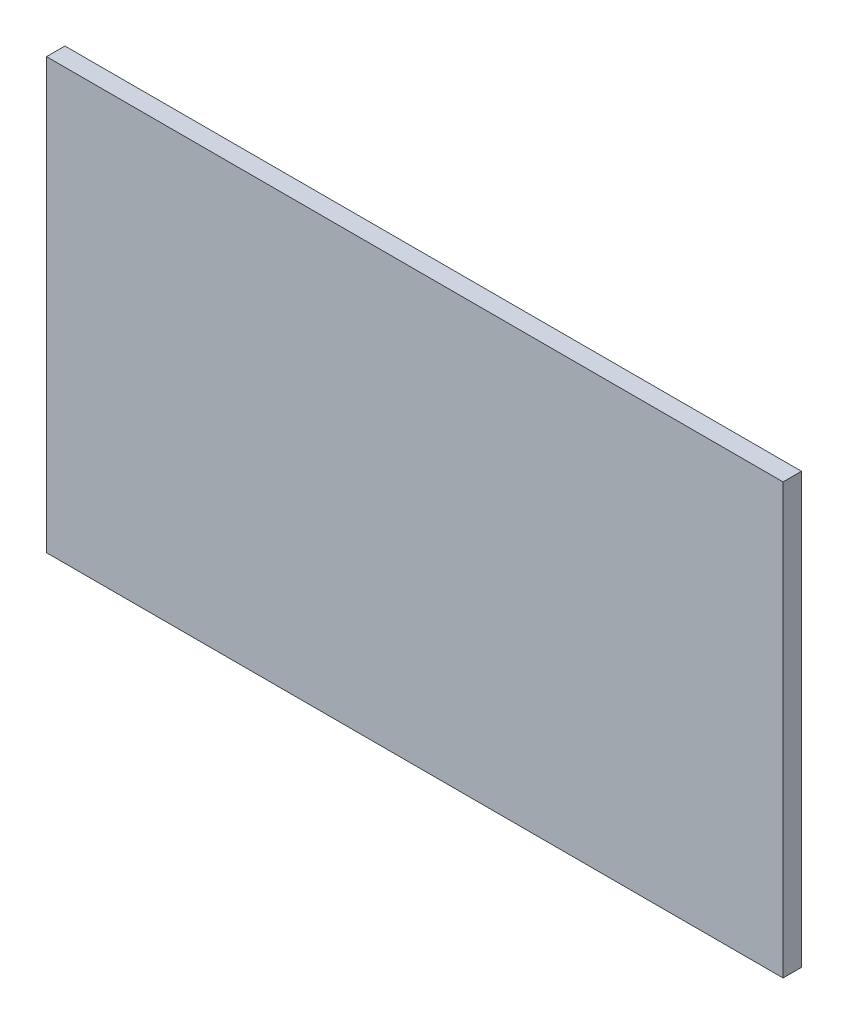
ISO-10303-21;
HEADER;
FILE_DESCRIPTION(('STEP AP214'),'2;1');
FILE_NAME('part.step','',(''),(''),'','','');
FILE_SCHEMA(('AUTOMOTIVE_DESIGN { 1 0 10303 214 1 1 1 1 }'));
ENDSEC;
DATA;
#1=APPLICATION_CONTEXT('core data for automotive mechanical design processes');
#2=APPLICATION_PROTOCOL_DEFINITION('international standard','automotive_design',2000,#1);
#3=PRODUCT_CONTEXT('',#1,'mechanical');
#4=PRODUCT('Part','Part','',(#3));
#5=PRODUCT_RELATED_PRODUCT_CATEGORY('part','',(#4));
#6=PRODUCT_DEFINITION_FORMATION('','',#4);
#7=PRODUCT_DEFINITION_CONTEXT('part definition',#1,'design');
#8=PRODUCT_DEFINITION('design','',#6,#7);
#9=PRODUCT_DEFINITION_SHAPE('','',#8);
#10=(LENGTH_UNIT() NAMED_UNIT(*) SI_UNIT(.MILLI.,.METRE.));
#11=(NAMED_UNIT(*) PLANE_ANGLE_UNIT() SI_UNIT($,.RADIAN.));
#12=(NAMED_UNIT(*) SI_UNIT($,.STERADIAN.) SOLID_ANGLE_UNIT());
#13=UNCERTAINTY_MEASURE_WITH_UNIT(LENGTH_MEASURE(1.E-05),#10,'distance_accuracy_value','');
#14=(GEOMETRIC_REPRESENTATION_CONTEXT(3) GLOBAL_UNCERTAINTY_ASSIGNED_CONTEXT((#13)) GLOBAL_UNIT_ASSIGNED_CONTEXT((#10,
#11,#12)) REPRESENTATION_CONTEXT('',''));
#15=CARTESIAN_POINT('',(0.,0.,0.));
#16=DIRECTION('',(0.,0.,1.));
#17=DIRECTION('',(1.,0.,0.));
#18=AXIS2_PLACEMENT_3D('',#15,#16,#17);
#19=CARTESIAN_POINT('',(-30.,-7.5,3.));
#20=DIRECTION('',(0.,1.,0.));
#21=DIRECTION('',(0.,0.,1.));
#22=AXIS2_PLACEMENT_3D('',#19,#20,#21);
#23=PLANE('',#22);
#24=DIRECTION('',(0.707106781186555,0.,0.70710678118654));
#25=VECTOR('',#24,1.);
#26=CARTESIAN_POINT('',(22.,-7.5,0.));
#27=LINE('',#26,#25);
#28=CARTESIAN_POINT('',(22.,-7.5,0.));
#29=VERTEX_POINT('',#28);
#30=CARTESIAN_POINT('',(23.5,-7.5,1.50000000000001));
#31=VERTEX_POINT('',#30);
#32=EDGE_CURVE('E65',#29,#31,#27,.T.);
#33=ORIENTED_EDGE('',*,*,#32,.T.);
#34=DIRECTION('',(-1.,0.,0.));
#35=VECTOR('',#34,1.);
#36=CARTESIAN_POINT('',(-30.,-7.5,1.50000000000001));
#37=LINE('',#36,#35);
#38=CARTESIAN_POINT('',(8.49999999999999,-7.5,1.50000000000001));
#39=VERTEX_POINT('',#38);
#40=EDGE_CURVE('E11',#31,#39,#37,.T.);
#41=ORIENTED_EDGE('',*,*,#40,.T.);
#42=DIRECTION('',(0.707106781186548,0.,-0.707106781186547));
#43=VECTOR('',#42,1.);
#44=CARTESIAN_POINT('',(8.49999999999999,-7.5,1.5));
#45=LINE('',#44,#43);
#46=CARTESIAN_POINT('',(9.99999999999999,-7.5,0.));
#47=VERTEX_POINT('',#46);
#48=EDGE_CURVE('E325',#39,#47,#45,.T.);
#49=ORIENTED_EDGE('',*,*,#48,.T.);
#50=DIRECTION('',(1.,0.,0.));
#51=VECTOR('',#50,1.);
#52=CARTESIAN_POINT('',(-30.,-7.5,0.));
#53=LINE('',#52,#51);
#54=EDGE_CURVE('E522',#47,#29,#53,.T.);
#55=ORIENTED_EDGE('',*,*,#54,.T.);
#56=EDGE_LOOP('',(#33,#41,#49,#55));
#57=FACE_BOUND('',#56,.T.);
#58=ADVANCED_FACE('F39',(#57),#23,.F.);
#59=CARTESIAN_POINT('',(-30.,7.5,3.));
#60=DIRECTION('',(0.,-1.,0.));
#61=DIRECTION('',(0.,0.,-1.));
#62=AXIS2_PLACEMENT_3D('',#59,#60,#61);
#63=PLANE('',#62);
#64=DIRECTION('',(-1.,0.,0.));
#65=VECTOR('',#64,1.);
#66=CARTESIAN_POINT('',(-30.,7.5,1.50000000000001));
#67=LINE('',#66,#65);
#68=CARTESIAN_POINT('',(23.5,7.5,1.5));
#69=VERTEX_POINT('',#68);
#70=CARTESIAN_POINT('',(8.49999999999999,7.5,1.5));
#71=VERTEX_POINT('',#70);
#72=EDGE_CURVE('E273',#69,#71,#67,.T.);
#73=ORIENTED_EDGE('',*,*,#72,.F.);
#74=DIRECTION('',(0.707106781186555,0.,0.70710678118654));
#75=VECTOR('',#74,1.);
#76=CARTESIAN_POINT('',(22.,7.5,0.));
#77=LINE('',#76,#75);
#78=CARTESIAN_POINT('',(22.,7.5,0.));
#79=VERTEX_POINT('',#78);
#80=EDGE_CURVE('E310',#79,#69,#77,.T.);
#81=ORIENTED_EDGE('',*,*,#80,.F.);
#82=DIRECTION('',(-1.,0.,0.));
#83=VECTOR('',#82,1.);
#84=CARTESIAN_POINT('',(-30.,7.5,0.));
#85=LINE('',#84,#83);
#86=CARTESIAN_POINT('',(9.99999999999999,7.5,0.));
#87=VERTEX_POINT('',#86);
#88=EDGE_CURVE('E517',#79,#87,#85,.T.);
#89=ORIENTED_EDGE('',*,*,#88,.T.);
#90=DIRECTION('',(0.707106781186548,0.,-0.707106781186547));
#91=VECTOR('',#90,1.);
#92=CARTESIAN_POINT('',(8.49999999999999,7.5,1.5));
#93=LINE('',#92,#91);
#94=EDGE_CURVE('E289',#71,#87,#93,.T.);
#95=ORIENTED_EDGE('',*,*,#94,.F.);
#96=EDGE_LOOP('',(#73,#81,#89,#95));
#97=FACE_BOUND('',#96,.T.);
#98=ADVANCED_FACE('F565',(#97),#63,.F.);
#99=CARTESIAN_POINT('',(-8.49999999999999,7.5,1.5));
#100=VERTEX_POINT('',#99);
#101=CARTESIAN_POINT('',(-23.5,7.5,1.5));
#102=VERTEX_POINT('',#101);
#103=EDGE_CURVE('E277',#100,#102,#67,.T.);
#104=ORIENTED_EDGE('',*,*,#103,.F.);
#105=DIRECTION('',(-0.707106781186548,0.,-0.707106781186547));
#106=VECTOR('',#105,1.);
#107=CARTESIAN_POINT('',(-8.49999999999999,7.5,1.5));
#108=LINE('',#107,#106);
#109=CARTESIAN_POINT('',(-9.99999999999999,7.5,0.));
#110=VERTEX_POINT('',#109);
#111=EDGE_CURVE('E272',#100,#110,#108,.T.);
#112=ORIENTED_EDGE('',*,*,#111,.T.);
#113=CARTESIAN_POINT('',(-22.,7.5,0.));
#114=VERTEX_POINT('',#113);
#115=EDGE_CURVE('E492',#110,#114,#85,.T.);
#116=ORIENTED_EDGE('',*,*,#115,.T.);
#117=DIRECTION('',(-0.707106781186555,0.,0.70710678118654));
#118=VECTOR('',#117,1.);
#119=CARTESIAN_POINT('',(-22.,7.5,0.));
#120=LINE('',#119,#118);
#121=EDGE_CURVE('E57',#114,#102,#120,.T.);
#122=ORIENTED_EDGE('',*,*,#121,.T.);
#123=EDGE_LOOP('',(#104,#112,#116,#122));
#124=FACE_BOUND('',#123,.T.);
#125=ADVANCED_FACE('F545',(#124),#63,.F.);
#126=CARTESIAN_POINT('',(-30.,-7.5,3.));
#127=DIRECTION('',(1.,0.,0.));
#128=DIRECTION('',(0.,0.,-1.));
#129=AXIS2_PLACEMENT_3D('',#126,#127,#128);
#130=PLANE('',#129);
#131=DIRECTION('',(0.,1.,0.));
#132=VECTOR('',#131,1.);
#133=CARTESIAN_POINT('',(-30.,-7.5,1.5));
#134=LINE('',#133,#132);
#135=CARTESIAN_POINT('',(-30.,-17.5,1.50000000000001));
#136=VERTEX_POINT('',#135);
#137=CARTESIAN_POINT('',(-30.,17.5,1.50000000000001));
#138=VERTEX_POINT('',#137);
#139=EDGE_CURVE('E282',#136,#138,#134,.T.);
#140=ORIENTED_EDGE('',*,*,#139,.F.);
#141=DIRECTION('',(0.,0.,1.));
#142=VECTOR('',#141,1.);
#143=CARTESIAN_POINT('',(-30.,-17.5,3.));
#144=LINE('',#143,#142);
#145=CARTESIAN_POINT('',(-30.,-17.5,3.));
#146=VERTEX_POINT('',#145);
#147=EDGE_CURVE('E252',#136,#146,#144,.T.);
#148=ORIENTED_EDGE('',*,*,#147,.T.);
#149=DIRECTION('',(0.,-1.,0.));
#150=VECTOR('',#149,1.);
#151=CARTESIAN_POINT('',(-30.,-7.5,3.));
#152=LINE('',#151,#150);
#153=CARTESIAN_POINT('',(-30.,17.5,3.));
#154=VERTEX_POINT('',#153);
#155=EDGE_CURVE('E238',#154,#146,#152,.T.);
#156=ORIENTED_EDGE('',*,*,#155,.F.);
#157=DIRECTION('',(0.,0.,1.));
#158=VECTOR('',#157,1.);
#159=CARTESIAN_POINT('',(-30.,17.5,3.));
#160=LINE('',#159,#158);
#161=EDGE_CURVE('E265',#138,#154,#160,.T.);
#162=ORIENTED_EDGE('',*,*,#161,.F.);
#163=EDGE_LOOP('',(#140,#148,#156,#162));
#164=FACE_BOUND('',#163,.T.);
#165=ADVANCED_FACE('F573',(#164),#130,.F.);
#166=DIRECTION('',(-0.707106781186548,0.,-0.707106781186547));
#167=VECTOR('',#166,1.);
#168=CARTESIAN_POINT('',(-8.49999999999999,-7.5,1.5));
#169=LINE('',#168,#167);
#170=CARTESIAN_POINT('',(-8.49999999999998,-7.5,1.50000000000001));
#171=VERTEX_POINT('',#170);
#172=CARTESIAN_POINT('',(-9.99999999999999,-7.5,0.));
#173=VERTEX_POINT('',#172);
#174=EDGE_CURVE('E295',#171,#173,#169,.T.);
#175=ORIENTED_EDGE('',*,*,#174,.F.);
#176=CARTESIAN_POINT('',(-23.5,-7.5,1.50000000000001));
#177=VERTEX_POINT('',#176);
#178=EDGE_CURVE('E49',#171,#177,#37,.T.);
#179=ORIENTED_EDGE('',*,*,#178,.T.);
#180=DIRECTION('',(-0.707106781186555,0.,0.70710678118654));
#181=VECTOR('',#180,1.);
#182=CARTESIAN_POINT('',(-22.,-7.5,0.));
#183=LINE('',#182,#181);
#184=CARTESIAN_POINT('',(-22.,-7.5,0.));
#185=VERTEX_POINT('',#184);
#186=EDGE_CURVE('E278',#185,#177,#183,.T.);
#187=ORIENTED_EDGE('',*,*,#186,.F.);
#188=EDGE_CURVE('E43',#185,#173,#53,.T.);
#189=ORIENTED_EDGE('',*,*,#188,.T.);
#190=EDGE_LOOP('',(#175,#179,#187,#189));
#191=FACE_BOUND('',#190,.T.);
#192=ADVANCED_FACE('F537',(#191),#23,.F.);
#193=CARTESIAN_POINT('',(0.,0.,0.));
#194=DIRECTION('',(0.,0.,-1.));
#195=DIRECTION('',(-1.,0.,0.));
#196=AXIS2_PLACEMENT_3D('',#193,#194,#195);
#197=PLANE('',#196);
#198=DIRECTION('',(-1.,0.,0.));
#199=VECTOR('',#198,1.);
#200=CARTESIAN_POINT('',(-14.5,3.5,0.));
#201=LINE('',#200,#199);
#202=CARTESIAN_POINT('',(-14.5,3.5,0.));
#203=VERTEX_POINT('',#202);
#204=CARTESIAN_POINT('',(-17.5,3.5,0.));
#205=VERTEX_POINT('',#204);
#206=EDGE_CURVE('E346',#203,#205,#201,.T.);
#207=ORIENTED_EDGE('',*,*,#206,.T.);
#208=DIRECTION('',(0.,-1.,0.));
#209=VECTOR('',#208,1.);
#210=CARTESIAN_POINT('',(-17.5,3.5,0.));
#211=LINE('',#210,#209);
#212=CARTESIAN_POINT('',(-17.5,-2.5,0.));
#213=VERTEX_POINT('',#212);
#214=EDGE_CURVE('E416',#205,#213,#211,.T.);
#215=ORIENTED_EDGE('',*,*,#214,.T.);
#216=DIRECTION('',(-1.,0.,0.));
#217=VECTOR('',#216,1.);
#218=CARTESIAN_POINT('',(-14.5,-2.5,0.));
#219=LINE('',#218,#217);
#220=CARTESIAN_POINT('',(-14.5,-2.5,0.));
#221=VERTEX_POINT('',#220);
#222=EDGE_CURVE('E377',#221,#213,#219,.T.);
#223=ORIENTED_EDGE('',*,*,#222,.F.);
#224=DIRECTION('',(0.,-1.,0.));
#225=VECTOR('',#224,1.);
#226=CARTESIAN_POINT('',(-14.5,3.5,0.));
#227=LINE('',#226,#225);
#228=EDGE_CURVE('E420',#203,#221,#227,.T.);
#229=ORIENTED_EDGE('',*,*,#228,.F.);
#230=EDGE_LOOP('',(#207,#215,#223,#229));
#231=FACE_BOUND('',#230,.T.);
#232=ORIENTED_EDGE('',*,*,#188,.F.);
#233=DIRECTION('',(0.,1.,0.));
#234=VECTOR('',#233,1.);
#235=CARTESIAN_POINT('',(-22.,-7.5,0.));
#236=LINE('',#235,#234);
#237=EDGE_CURVE('E286',#185,#114,#236,.T.);
#238=ORIENTED_EDGE('',*,*,#237,.T.);
#239=ORIENTED_EDGE('',*,*,#115,.F.);
#240=DIRECTION('',(0.,1.,0.));
#241=VECTOR('',#240,1.);
#242=CARTESIAN_POINT('',(-9.99999999999999,-7.5,0.));
#243=LINE('',#242,#241);
#244=EDGE_CURVE('E298',#173,#110,#243,.T.);
#245=ORIENTED_EDGE('',*,*,#244,.F.);
#246=EDGE_LOOP('',(#232,#238,#239,#245));
#247=FACE_BOUND('',#246,.T.);
#248=ADVANCED_FACE('F540',(#231,#247),#197,.T.);
#249=DIRECTION('',(0.,1.,0.));
#250=VECTOR('',#249,1.);
#251=CARTESIAN_POINT('',(22.,-7.5,0.));
#252=LINE('',#251,#250);
#253=EDGE_CURVE('E309',#29,#79,#252,.T.);
#254=ORIENTED_EDGE('',*,*,#253,.F.);
#255=ORIENTED_EDGE('',*,*,#54,.F.);
#256=DIRECTION('',(0.,1.,0.));
#257=VECTOR('',#256,1.);
#258=CARTESIAN_POINT('',(9.99999999999999,-7.5,0.));
#259=LINE('',#258,#257);
#260=EDGE_CURVE('E314',#47,#87,#259,.T.);
#261=ORIENTED_EDGE('',*,*,#260,.T.);
#262=ORIENTED_EDGE('',*,*,#88,.F.);
#263=EDGE_LOOP('',(#254,#255,#261,#262));
#264=FACE_BOUND('',#263,.T.);
#265=DIRECTION('',(-1.,0.,0.));
#266=VECTOR('',#265,1.);
#267=CARTESIAN_POINT('',(14.5,3.5,0.));
#268=LINE('',#267,#266);
#269=CARTESIAN_POINT('',(17.5,3.5,0.));
#270=VERTEX_POINT('',#269);
#271=CARTESIAN_POINT('',(14.5,3.5,0.));
#272=VERTEX_POINT('',#271);
#273=EDGE_CURVE('E454',#270,#272,#268,.T.);
#274=ORIENTED_EDGE('',*,*,#273,.T.);
#275=DIRECTION('',(0.,-1.,0.));
#276=VECTOR('',#275,1.);
#277=CARTESIAN_POINT('',(14.5,3.5,0.));
#278=LINE('',#277,#276);
#279=CARTESIAN_POINT('',(14.5,-2.5,0.));
#280=VERTEX_POINT('',#279);
#281=EDGE_CURVE('E488',#272,#280,#278,.T.);
#282=ORIENTED_EDGE('',*,*,#281,.T.);
#283=DIRECTION('',(-1.,0.,0.));
#284=VECTOR('',#283,1.);
#285=CARTESIAN_POINT('',(14.5,-2.5,0.));
#286=LINE('',#285,#284);
#287=CARTESIAN_POINT('',(17.5,-2.5,0.));
#288=VERTEX_POINT('',#287);
#289=EDGE_CURVE('E431',#288,#280,#286,.T.);
#290=ORIENTED_EDGE('',*,*,#289,.F.);
#291=DIRECTION('',(0.,-1.,0.));
#292=VECTOR('',#291,1.);
#293=CARTESIAN_POINT('',(17.5,3.5,0.));
#294=LINE('',#293,#292);
#295=EDGE_CURVE('E493',#270,#288,#294,.T.);
#296=ORIENTED_EDGE('',*,*,#295,.F.);
#297=EDGE_LOOP('',(#274,#282,#290,#296));
#298=FACE_BOUND('',#297,.T.);
#299=ADVANCED_FACE('F578',(#264,#298),#197,.T.);
#300=CARTESIAN_POINT('',(30.,-7.5,3.));
#301=DIRECTION('',(-1.,0.,0.));
#302=DIRECTION('',(0.,0.,1.));
#303=AXIS2_PLACEMENT_3D('',#300,#301,#302);
#304=PLANE('',#303);
#305=DIRECTION('',(0.,1.,0.));
#306=VECTOR('',#305,1.);
#307=CARTESIAN_POINT('',(30.,-7.5,3.));
#308=LINE('',#307,#306);
#309=CARTESIAN_POINT('',(30.,-17.5,3.));
#310=VERTEX_POINT('',#309);
#311=CARTESIAN_POINT('',(30.,17.5,3.));
#312=VERTEX_POINT('',#311);
#313=EDGE_CURVE('E227',#310,#312,#308,.T.);
#314=ORIENTED_EDGE('',*,*,#313,.F.);
#315=DIRECTION('',(0.,0.,-1.));
#316=VECTOR('',#315,1.);
#317=CARTESIAN_POINT('',(30.,-17.5,1.50000000000001));
#318=LINE('',#317,#316);
#319=CARTESIAN_POINT('',(30.,-17.5,1.50000000000001));
#320=VERTEX_POINT('',#319);
#321=EDGE_CURVE('E229',#310,#320,#318,.T.);
#322=ORIENTED_EDGE('',*,*,#321,.T.);
#323=DIRECTION('',(0.,1.,0.));
#324=VECTOR('',#323,1.);
#325=CARTESIAN_POINT('',(30.,-7.5,1.5));
#326=LINE('',#325,#324);
#327=CARTESIAN_POINT('',(30.,17.5,1.50000000000001));
#328=VERTEX_POINT('',#327);
#329=EDGE_CURVE('E315',#320,#328,#326,.T.);
#330=ORIENTED_EDGE('',*,*,#329,.T.);
#331=DIRECTION('',(0.,0.,-1.));
#332=VECTOR('',#331,1.);
#333=CARTESIAN_POINT('',(30.,17.5,1.50000000000001));
#334=LINE('',#333,#332);
#335=EDGE_CURVE('E232',#312,#328,#334,.T.);
#336=ORIENTED_EDGE('',*,*,#335,.F.);
#337=EDGE_LOOP('',(#314,#322,#330,#336));
#338=FACE_BOUND('',#337,.T.);
#339=ADVANCED_FACE('F41',(#338),#304,.F.);
#340=CARTESIAN_POINT('',(0.,0.,3.));
#341=DIRECTION('',(0.,0.,-1.));
#342=DIRECTION('',(-1.,0.,0.));
#343=AXIS2_PLACEMENT_3D('',#340,#341,#342);
#344=PLANE('',#343);
#345=ORIENTED_EDGE('',*,*,#313,.T.);
#346=DIRECTION('',(1.,0.,0.));
#347=VECTOR('',#346,1.);
#348=CARTESIAN_POINT('',(30.,17.5,3.));
#349=LINE('',#348,#347);
#350=EDGE_CURVE('E269',#154,#312,#349,.T.);
#351=ORIENTED_EDGE('',*,*,#350,.F.);
#352=ORIENTED_EDGE('',*,*,#155,.T.);
#353=DIRECTION('',(1.,0.,0.));
#354=VECTOR('',#353,1.);
#355=CARTESIAN_POINT('',(30.,-17.5,3.));
#356=LINE('',#355,#354);
#357=EDGE_CURVE('E244',#146,#310,#356,.T.);
#358=ORIENTED_EDGE('',*,*,#357,.T.);
#359=EDGE_LOOP('',(#345,#351,#352,#358));
#360=FACE_BOUND('',#359,.T.);
#361=ADVANCED_FACE('F250',(#360),#344,.F.);
#362=CARTESIAN_POINT('',(14.5,3.5,-3.4));
#363=DIRECTION('',(-1.,0.,0.));
#364=DIRECTION('',(0.,0.,1.));
#365=AXIS2_PLACEMENT_3D('',#362,#363,#364);
#366=PLANE('',#365);
#367=DIRECTION('',(0.,0.,-1.));
#368=VECTOR('',#367,1.);
#369=CARTESIAN_POINT('',(14.5,-2.5,-3.4));
#370=LINE('',#369,#368);
#371=CARTESIAN_POINT('',(14.5,-2.5,-3.4));
#372=VERTEX_POINT('',#371);
#373=EDGE_CURVE('E403',#280,#372,#370,.T.);
#374=ORIENTED_EDGE('',*,*,#373,.F.);
#375=ORIENTED_EDGE('',*,*,#281,.F.);
#376=DIRECTION('',(0.,0.,-1.));
#377=VECTOR('',#376,1.);
#378=CARTESIAN_POINT('',(14.5,3.5,-3.4));
#379=LINE('',#378,#377);
#380=CARTESIAN_POINT('',(14.5,3.5,-3.4));
#381=VERTEX_POINT('',#380);
#382=EDGE_CURVE('E426',#272,#381,#379,.T.);
#383=ORIENTED_EDGE('',*,*,#382,.T.);
#384=DIRECTION('',(0.,-1.,0.));
#385=VECTOR('',#384,1.);
#386=CARTESIAN_POINT('',(14.5,3.5,-3.4));
#387=LINE('',#386,#385);
#388=EDGE_CURVE('E458',#381,#372,#387,.T.);
#389=ORIENTED_EDGE('',*,*,#388,.T.);
#390=EDGE_LOOP('',(#374,#375,#383,#389));
#391=FACE_BOUND('',#390,.T.);
#392=ADVANCED_FACE('F652',(#391),#366,.T.);
#393=CARTESIAN_POINT('',(17.5,3.5,0.));
#394=DIRECTION('',(1.,0.,0.));
#395=DIRECTION('',(0.,0.,-1.));
#396=AXIS2_PLACEMENT_3D('',#393,#394,#395);
#397=PLANE('',#396);
#398=DIRECTION('',(0.,0.,1.));
#399=VECTOR('',#398,1.);
#400=CARTESIAN_POINT('',(17.5,-2.5,0.));
#401=LINE('',#400,#399);
#402=CARTESIAN_POINT('',(17.5,-2.5,-3.4));
#403=VERTEX_POINT('',#402);
#404=EDGE_CURVE('E482',#403,#288,#401,.T.);
#405=ORIENTED_EDGE('',*,*,#404,.F.);
#406=DIRECTION('',(0.,-1.,0.));
#407=VECTOR('',#406,1.);
#408=CARTESIAN_POINT('',(17.5,3.5,-3.4));
#409=LINE('',#408,#407);
#410=CARTESIAN_POINT('',(17.5,3.5,-3.4));
#411=VERTEX_POINT('',#410);
#412=EDGE_CURVE('E497',#411,#403,#409,.T.);
#413=ORIENTED_EDGE('',*,*,#412,.F.);
#414=DIRECTION('',(0.,0.,1.));
#415=VECTOR('',#414,1.);
#416=CARTESIAN_POINT('',(17.5,3.5,0.));
#417=LINE('',#416,#415);
#418=EDGE_CURVE('E451',#411,#270,#417,.T.);
#419=ORIENTED_EDGE('',*,*,#418,.T.);
#420=ORIENTED_EDGE('',*,*,#295,.T.);
#421=EDGE_LOOP('',(#405,#413,#419,#420));
#422=FACE_BOUND('',#421,.T.);
#423=ADVANCED_FACE('F648',(#422),#397,.T.);
#424=CARTESIAN_POINT('',(17.5,3.5,-3.4));
#425=DIRECTION('',(0.,0.,1.));
#426=DIRECTION('',(1.,0.,0.));
#427=AXIS2_PLACEMENT_3D('',#424,#425,#426);
#428=PLANE('',#427);
#429=DIRECTION('',(-1.,0.,0.));
#430=VECTOR('',#429,1.);
#431=CARTESIAN_POINT('',(17.5,-2.5,-3.4));
#432=LINE('',#431,#430);
#433=CARTESIAN_POINT('',(18.9,-2.5,-3.4));
#434=VERTEX_POINT('',#433);
#435=EDGE_CURVE('E478',#434,#403,#432,.T.);
#436=ORIENTED_EDGE('',*,*,#435,.F.);
#437=DIRECTION('',(0.,-1.,0.));
#438=VECTOR('',#437,1.);
#439=CARTESIAN_POINT('',(18.9,3.5,-3.4));
#440=LINE('',#439,#438);
#441=CARTESIAN_POINT('',(18.9,3.5,-3.4));
#442=VERTEX_POINT('',#441);
#443=EDGE_CURVE('E500',#442,#434,#440,.T.);
#444=ORIENTED_EDGE('',*,*,#443,.F.);
#445=DIRECTION('',(-1.,0.,0.));
#446=VECTOR('',#445,1.);
#447=CARTESIAN_POINT('',(17.5,3.5,-3.4));
#448=LINE('',#447,#446);
#449=EDGE_CURVE('E447',#442,#411,#448,.T.);
#450=ORIENTED_EDGE('',*,*,#449,.T.);
#451=ORIENTED_EDGE('',*,*,#412,.T.);
#452=EDGE_LOOP('',(#436,#444,#450,#451));
#453=FACE_BOUND('',#452,.T.);
#454=ADVANCED_FACE('F651',(#453),#428,.T.);
#455=CARTESIAN_POINT('',(18.9,3.5,-3.4));
#456=DIRECTION('',(1.,0.,0.));
#457=DIRECTION('',(0.,0.,-1.));
#458=AXIS2_PLACEMENT_3D('',#455,#456,#457);
#459=PLANE('',#458);
#460=DIRECTION('',(0.,0.,1.));
#461=VECTOR('',#460,1.);
#462=CARTESIAN_POINT('',(18.9,-2.5,-3.4));
#463=LINE('',#462,#461);
#464=CARTESIAN_POINT('',(18.9,-2.5,-5.4));
#465=VERTEX_POINT('',#464);
#466=EDGE_CURVE('E474',#465,#434,#463,.T.);
#467=ORIENTED_EDGE('',*,*,#466,.F.);
#468=DIRECTION('',(0.,-1.,0.));
#469=VECTOR('',#468,1.);
#470=CARTESIAN_POINT('',(18.9,3.5,-5.4));
#471=LINE('',#470,#469);
#472=CARTESIAN_POINT('',(18.9,3.5,-5.4));
#473=VERTEX_POINT('',#472);
#474=EDGE_CURVE('E503',#473,#465,#471,.T.);
#475=ORIENTED_EDGE('',*,*,#474,.F.);
#476=DIRECTION('',(0.,0.,1.));
#477=VECTOR('',#476,1.);
#478=CARTESIAN_POINT('',(18.9,3.5,-3.4));
#479=LINE('',#478,#477);
#480=EDGE_CURVE('E443',#473,#442,#479,.T.);
#481=ORIENTED_EDGE('',*,*,#480,.T.);
#482=ORIENTED_EDGE('',*,*,#443,.T.);
#483=EDGE_LOOP('',(#467,#475,#481,#482));
#484=FACE_BOUND('',#483,.T.);
#485=ADVANCED_FACE('F656',(#484),#459,.T.);
#486=CARTESIAN_POINT('',(18.9,3.5,-5.4));
#487=DIRECTION('',(0.,0.,-1.));
#488=DIRECTION('',(-1.,0.,0.));
#489=AXIS2_PLACEMENT_3D('',#486,#487,#488);
#490=PLANE('',#489);
#491=DIRECTION('',(1.,0.,0.));
#492=VECTOR('',#491,1.);
#493=CARTESIAN_POINT('',(18.9,-2.5,-5.4));
#494=LINE('',#493,#492);
#495=CARTESIAN_POINT('',(13.1,-2.5,-5.4));
#496=VERTEX_POINT('',#495);
#497=EDGE_CURVE('E470',#496,#465,#494,.T.);
#498=ORIENTED_EDGE('',*,*,#497,.F.);
#499=DIRECTION('',(0.,-1.,0.));
#500=VECTOR('',#499,1.);
#501=CARTESIAN_POINT('',(13.1,3.5,-5.4));
#502=LINE('',#501,#500);
#503=CARTESIAN_POINT('',(13.1,3.5,-5.4));
#504=VERTEX_POINT('',#503);
#505=EDGE_CURVE('E506',#504,#496,#502,.T.);
#506=ORIENTED_EDGE('',*,*,#505,.F.);
#507=DIRECTION('',(1.,0.,0.));
#508=VECTOR('',#507,1.);
#509=CARTESIAN_POINT('',(18.9,3.5,-5.4));
#510=LINE('',#509,#508);
#511=EDGE_CURVE('E439',#504,#473,#510,.T.);
#512=ORIENTED_EDGE('',*,*,#511,.T.);
#513=ORIENTED_EDGE('',*,*,#474,.T.);
#514=EDGE_LOOP('',(#498,#506,#512,#513));
#515=FACE_BOUND('',#514,.T.);
#516=ADVANCED_FACE('F660',(#515),#490,.T.);
#517=CARTESIAN_POINT('',(13.1,3.5,-5.4));
#518=DIRECTION('',(-1.,0.,0.));
#519=DIRECTION('',(0.,0.,1.));
#520=AXIS2_PLACEMENT_3D('',#517,#518,#519);
#521=PLANE('',#520);
#522=DIRECTION('',(0.,0.,-1.));
#523=VECTOR('',#522,1.);
#524=CARTESIAN_POINT('',(13.1,-2.5,-5.4));
#525=LINE('',#524,#523);
#526=CARTESIAN_POINT('',(13.1,-2.5,-3.4));
#527=VERTEX_POINT('',#526);
#528=EDGE_CURVE('E466',#527,#496,#525,.T.);
#529=ORIENTED_EDGE('',*,*,#528,.F.);
#530=DIRECTION('',(0.,-1.,0.));
#531=VECTOR('',#530,1.);
#532=CARTESIAN_POINT('',(13.1,3.5,-3.4));
#533=LINE('',#532,#531);
#534=CARTESIAN_POINT('',(13.1,3.5,-3.4));
#535=VERTEX_POINT('',#534);
#536=EDGE_CURVE('E509',#535,#527,#533,.T.);
#537=ORIENTED_EDGE('',*,*,#536,.F.);
#538=DIRECTION('',(0.,0.,-1.));
#539=VECTOR('',#538,1.);
#540=CARTESIAN_POINT('',(13.1,3.5,-5.4));
#541=LINE('',#540,#539);
#542=EDGE_CURVE('E435',#535,#504,#541,.T.);
#543=ORIENTED_EDGE('',*,*,#542,.T.);
#544=ORIENTED_EDGE('',*,*,#505,.T.);
#545=EDGE_LOOP('',(#529,#537,#543,#544));
#546=FACE_BOUND('',#545,.T.);
#547=ADVANCED_FACE('F664',(#546),#521,.T.);
#548=CARTESIAN_POINT('',(13.1,3.5,-3.4));
#549=DIRECTION('',(0.,0.,1.));
#550=DIRECTION('',(1.,0.,0.));
#551=AXIS2_PLACEMENT_3D('',#548,#549,#550);
#552=PLANE('',#551);
#553=DIRECTION('',(-1.,0.,0.));
#554=VECTOR('',#553,1.);
#555=CARTESIAN_POINT('',(13.1,-2.5,-3.4));
#556=LINE('',#555,#554);
#557=EDGE_CURVE('E462',#372,#527,#556,.T.);
#558=ORIENTED_EDGE('',*,*,#557,.F.);
#559=ORIENTED_EDGE('',*,*,#388,.F.);
#560=DIRECTION('',(-1.,0.,0.));
#561=VECTOR('',#560,1.);
#562=CARTESIAN_POINT('',(13.1,3.5,-3.4));
#563=LINE('',#562,#561);
#564=EDGE_CURVE('E430',#381,#535,#563,.T.);
#565=ORIENTED_EDGE('',*,*,#564,.T.);
#566=ORIENTED_EDGE('',*,*,#536,.T.);
#567=EDGE_LOOP('',(#558,#559,#565,#566));
#568=FACE_BOUND('',#567,.T.);
#569=ADVANCED_FACE('F643',(#568),#552,.T.);
#570=CARTESIAN_POINT('',(0.,3.5,0.));
#571=DIRECTION('',(0.,1.,0.));
#572=DIRECTION('',(0.,0.,1.));
#573=AXIS2_PLACEMENT_3D('',#570,#571,#572);
#574=PLANE('',#573);
#575=ORIENTED_EDGE('',*,*,#382,.F.);
#576=ORIENTED_EDGE('',*,*,#273,.F.);
#577=ORIENTED_EDGE('',*,*,#418,.F.);
#578=ORIENTED_EDGE('',*,*,#449,.F.);
#579=ORIENTED_EDGE('',*,*,#480,.F.);
#580=ORIENTED_EDGE('',*,*,#511,.F.);
#581=ORIENTED_EDGE('',*,*,#542,.F.);
#582=ORIENTED_EDGE('',*,*,#564,.F.);
#583=EDGE_LOOP('',(#575,#576,#577,#578,#579,#580,#581,#582));
#584=FACE_BOUND('',#583,.T.);
#585=ADVANCED_FACE('F640',(#584),#574,.T.);
#586=CARTESIAN_POINT('',(0.,-2.5,0.));
#587=DIRECTION('',(0.,1.,0.));
#588=DIRECTION('',(0.,0.,1.));
#589=AXIS2_PLACEMENT_3D('',#586,#587,#588);
#590=PLANE('',#589);
#591=ORIENTED_EDGE('',*,*,#373,.T.);
#592=ORIENTED_EDGE('',*,*,#557,.T.);
#593=ORIENTED_EDGE('',*,*,#528,.T.);
#594=ORIENTED_EDGE('',*,*,#497,.T.);
#595=ORIENTED_EDGE('',*,*,#466,.T.);
#596=ORIENTED_EDGE('',*,*,#435,.T.);
#597=ORIENTED_EDGE('',*,*,#404,.T.);
#598=ORIENTED_EDGE('',*,*,#289,.T.);
#599=EDGE_LOOP('',(#591,#592,#593,#594,#595,#596,#597,#598));
#600=FACE_BOUND('',#599,.T.);
#601=ADVANCED_FACE('F638',(#600),#590,.F.);
#602=CARTESIAN_POINT('',(-13.1,3.5,-3.4));
#603=DIRECTION('',(0.,0.,1.));
#604=DIRECTION('',(1.,0.,0.));
#605=AXIS2_PLACEMENT_3D('',#602,#603,#604);
#606=PLANE('',#605);
#607=DIRECTION('',(-1.,0.,0.));
#608=VECTOR('',#607,1.);
#609=CARTESIAN_POINT('',(-13.1,-2.5,-3.4));
#610=LINE('',#609,#608);
#611=CARTESIAN_POINT('',(-13.1,-2.5,-3.4));
#612=VERTEX_POINT('',#611);
#613=CARTESIAN_POINT('',(-14.5,-2.5,-3.4));
#614=VERTEX_POINT('',#613);
#615=EDGE_CURVE('E318',#612,#614,#610,.T.);
#616=ORIENTED_EDGE('',*,*,#615,.F.);
#617=DIRECTION('',(0.,-1.,0.));
#618=VECTOR('',#617,1.);
#619=CARTESIAN_POINT('',(-13.1,3.5,-3.4));
#620=LINE('',#619,#618);
#621=CARTESIAN_POINT('',(-13.1,3.5,-3.4));
#622=VERTEX_POINT('',#621);
#623=EDGE_CURVE('E400',#622,#612,#620,.T.);
#624=ORIENTED_EDGE('',*,*,#623,.F.);
#625=DIRECTION('',(-1.,0.,0.));
#626=VECTOR('',#625,1.);
#627=CARTESIAN_POINT('',(-13.1,3.5,-3.4));
#628=LINE('',#627,#626);
#629=CARTESIAN_POINT('',(-14.5,3.5,-3.4));
#630=VERTEX_POINT('',#629);
#631=EDGE_CURVE('E337',#622,#630,#628,.T.);
#632=ORIENTED_EDGE('',*,*,#631,.T.);
#633=DIRECTION('',(0.,-1.,0.));
#634=VECTOR('',#633,1.);
#635=CARTESIAN_POINT('',(-14.5,3.5,-3.4));
#636=LINE('',#635,#634);
#637=EDGE_CURVE('E370',#630,#614,#636,.T.);
#638=ORIENTED_EDGE('',*,*,#637,.T.);
#639=EDGE_LOOP('',(#616,#624,#632,#638));
#640=FACE_BOUND('',#639,.T.);
#641=ADVANCED_FACE('F616',(#640),#606,.T.);
#642=CARTESIAN_POINT('',(-13.1,3.5,-5.4));
#643=DIRECTION('',(1.,0.,0.));
#644=DIRECTION('',(0.,0.,-1.));
#645=AXIS2_PLACEMENT_3D('',#642,#643,#644);
#646=PLANE('',#645);
#647=DIRECTION('',(0.,0.,1.));
#648=VECTOR('',#647,1.);
#649=CARTESIAN_POINT('',(-13.1,-2.5,-5.4));
#650=LINE('',#649,#648);
#651=CARTESIAN_POINT('',(-13.1,-2.5,-5.4));
#652=VERTEX_POINT('',#651);
#653=EDGE_CURVE('E342',#652,#612,#650,.T.);
#654=ORIENTED_EDGE('',*,*,#653,.F.);
#655=DIRECTION('',(0.,-1.,0.));
#656=VECTOR('',#655,1.);
#657=CARTESIAN_POINT('',(-13.1,3.5,-5.4));
#658=LINE('',#657,#656);
#659=CARTESIAN_POINT('',(-13.1,3.5,-5.4));
#660=VERTEX_POINT('',#659);
#661=EDGE_CURVE('E404',#660,#652,#658,.T.);
#662=ORIENTED_EDGE('',*,*,#661,.F.);
#663=DIRECTION('',(0.,0.,1.));
#664=VECTOR('',#663,1.);
#665=CARTESIAN_POINT('',(-13.1,3.5,-5.4));
#666=LINE('',#665,#664);
#667=EDGE_CURVE('E366',#660,#622,#666,.T.);
#668=ORIENTED_EDGE('',*,*,#667,.T.);
#669=ORIENTED_EDGE('',*,*,#623,.T.);
#670=EDGE_LOOP('',(#654,#662,#668,#669));
#671=FACE_BOUND('',#670,.T.);
#672=ADVANCED_FACE('F612',(#671),#646,.T.);
#673=CARTESIAN_POINT('',(-18.9,3.5,-5.4));
#674=DIRECTION('',(0.,0.,-1.));
#675=DIRECTION('',(-1.,0.,0.));
#676=AXIS2_PLACEMENT_3D('',#673,#674,#675);
#677=PLANE('',#676);
#678=DIRECTION('',(1.,0.,0.));
#679=VECTOR('',#678,1.);
#680=CARTESIAN_POINT('',(-18.9,-2.5,-5.4));
#681=LINE('',#680,#679);
#682=CARTESIAN_POINT('',(-18.9,-2.5,-5.4));
#683=VERTEX_POINT('',#682);
#684=EDGE_CURVE('E393',#683,#652,#681,.T.);
#685=ORIENTED_EDGE('',*,*,#684,.F.);
#686=DIRECTION('',(0.,-1.,0.));
#687=VECTOR('',#686,1.);
#688=CARTESIAN_POINT('',(-18.9,3.5,-5.4));
#689=LINE('',#688,#687);
#690=CARTESIAN_POINT('',(-18.9,3.5,-5.4));
#691=VERTEX_POINT('',#690);
#692=EDGE_CURVE('E407',#691,#683,#689,.T.);
#693=ORIENTED_EDGE('',*,*,#692,.F.);
#694=DIRECTION('',(1.,0.,0.));
#695=VECTOR('',#694,1.);
#696=CARTESIAN_POINT('',(-18.9,3.5,-5.4));
#697=LINE('',#696,#695);
#698=EDGE_CURVE('E362',#691,#660,#697,.T.);
#699=ORIENTED_EDGE('',*,*,#698,.T.);
#700=ORIENTED_EDGE('',*,*,#661,.T.);
#701=EDGE_LOOP('',(#685,#693,#699,#700));
#702=FACE_BOUND('',#701,.T.);
#703=ADVANCED_FACE('F615',(#702),#677,.T.);
#704=CARTESIAN_POINT('',(-18.9,3.5,-3.4));
#705=DIRECTION('',(-1.,0.,0.));
#706=DIRECTION('',(0.,0.,1.));
#707=AXIS2_PLACEMENT_3D('',#704,#705,#706);
#708=PLANE('',#707);
#709=DIRECTION('',(0.,0.,-1.));
#710=VECTOR('',#709,1.);
#711=CARTESIAN_POINT('',(-18.9,-2.5,-3.4));
#712=LINE('',#711,#710);
#713=CARTESIAN_POINT('',(-18.9,-2.5,-3.4));
#714=VERTEX_POINT('',#713);
#715=EDGE_CURVE('E389',#714,#683,#712,.T.);
#716=ORIENTED_EDGE('',*,*,#715,.F.);
#717=DIRECTION('',(0.,-1.,0.));
#718=VECTOR('',#717,1.);
#719=CARTESIAN_POINT('',(-18.9,3.5,-3.4));
#720=LINE('',#719,#718);
#721=CARTESIAN_POINT('',(-18.9,3.5,-3.4));
#722=VERTEX_POINT('',#721);
#723=EDGE_CURVE('E410',#722,#714,#720,.T.);
#724=ORIENTED_EDGE('',*,*,#723,.F.);
#725=DIRECTION('',(0.,0.,-1.));
#726=VECTOR('',#725,1.);
#727=CARTESIAN_POINT('',(-18.9,3.5,-3.4));
#728=LINE('',#727,#726);
#729=EDGE_CURVE('E358',#722,#691,#728,.T.);
#730=ORIENTED_EDGE('',*,*,#729,.T.);
#731=ORIENTED_EDGE('',*,*,#692,.T.);
#732=EDGE_LOOP('',(#716,#724,#730,#731));
#733=FACE_BOUND('',#732,.T.);
#734=ADVANCED_FACE('F620',(#733),#708,.T.);
#735=CARTESIAN_POINT('',(-17.5,3.5,-3.4));
#736=DIRECTION('',(0.,0.,1.));
#737=DIRECTION('',(1.,0.,0.));
#738=AXIS2_PLACEMENT_3D('',#735,#736,#737);
#739=PLANE('',#738);
#740=DIRECTION('',(-1.,0.,0.));
#741=VECTOR('',#740,1.);
#742=CARTESIAN_POINT('',(-17.5,-2.5,-3.4));
#743=LINE('',#742,#741);
#744=CARTESIAN_POINT('',(-17.5,-2.5,-3.4));
#745=VERTEX_POINT('',#744);
#746=EDGE_CURVE('E385',#745,#714,#743,.T.);
#747=ORIENTED_EDGE('',*,*,#746,.F.);
#748=DIRECTION('',(0.,-1.,0.));
#749=VECTOR('',#748,1.);
#750=CARTESIAN_POINT('',(-17.5,3.5,-3.4));
#751=LINE('',#750,#749);
#752=CARTESIAN_POINT('',(-17.5,3.5,-3.4));
#753=VERTEX_POINT('',#752);
#754=EDGE_CURVE('E413',#753,#745,#751,.T.);
#755=ORIENTED_EDGE('',*,*,#754,.F.);
#756=DIRECTION('',(-1.,0.,0.));
#757=VECTOR('',#756,1.);
#758=CARTESIAN_POINT('',(-17.5,3.5,-3.4));
#759=LINE('',#758,#757);
#760=EDGE_CURVE('E354',#753,#722,#759,.T.);
#761=ORIENTED_EDGE('',*,*,#760,.T.);
#762=ORIENTED_EDGE('',*,*,#723,.T.);
#763=EDGE_LOOP('',(#747,#755,#761,#762));
#764=FACE_BOUND('',#763,.T.);
#765=ADVANCED_FACE('F624',(#764),#739,.T.);
#766=CARTESIAN_POINT('',(-17.5,3.5,0.));
#767=DIRECTION('',(-1.,0.,0.));
#768=DIRECTION('',(0.,0.,1.));
#769=AXIS2_PLACEMENT_3D('',#766,#767,#768);
#770=PLANE('',#769);
#771=DIRECTION('',(0.,0.,-1.));
#772=VECTOR('',#771,1.);
#773=CARTESIAN_POINT('',(-17.5,-2.5,0.));
#774=LINE('',#773,#772);
#775=EDGE_CURVE('E381',#213,#745,#774,.T.);
#776=ORIENTED_EDGE('',*,*,#775,.F.);
#777=ORIENTED_EDGE('',*,*,#214,.F.);
#778=DIRECTION('',(0.,0.,-1.));
#779=VECTOR('',#778,1.);
#780=CARTESIAN_POINT('',(-17.5,3.5,0.));
#781=LINE('',#780,#779);
#782=EDGE_CURVE('E350',#205,#753,#781,.T.);
#783=ORIENTED_EDGE('',*,*,#782,.T.);
#784=ORIENTED_EDGE('',*,*,#754,.T.);
#785=EDGE_LOOP('',(#776,#777,#783,#784));
#786=FACE_BOUND('',#785,.T.);
#787=ADVANCED_FACE('F628',(#786),#770,.T.);
#788=CARTESIAN_POINT('',(-14.5,3.5,-3.4));
#789=DIRECTION('',(1.,0.,0.));
#790=DIRECTION('',(0.,0.,-1.));
#791=AXIS2_PLACEMENT_3D('',#788,#789,#790);
#792=PLANE('',#791);
#793=DIRECTION('',(0.,0.,1.));
#794=VECTOR('',#793,1.);
#795=CARTESIAN_POINT('',(-14.5,-2.5,-3.4));
#796=LINE('',#795,#794);
#797=EDGE_CURVE('E374',#614,#221,#796,.T.);
#798=ORIENTED_EDGE('',*,*,#797,.F.);
#799=ORIENTED_EDGE('',*,*,#637,.F.);
#800=DIRECTION('',(0.,0.,1.));
#801=VECTOR('',#800,1.);
#802=CARTESIAN_POINT('',(-14.5,3.5,-3.4));
#803=LINE('',#802,#801);
#804=EDGE_CURVE('E341',#630,#203,#803,.T.);
#805=ORIENTED_EDGE('',*,*,#804,.T.);
#806=ORIENTED_EDGE('',*,*,#228,.T.);
#807=EDGE_LOOP('',(#798,#799,#805,#806));
#808=FACE_BOUND('',#807,.T.);
#809=ADVANCED_FACE('F607',(#808),#792,.T.);
#810=CARTESIAN_POINT('',(0.,3.5,0.));
#811=DIRECTION('',(0.,1.,0.));
#812=DIRECTION('',(0.,0.,1.));
#813=AXIS2_PLACEMENT_3D('',#810,#811,#812);
#814=PLANE('',#813);
#815=ORIENTED_EDGE('',*,*,#631,.F.);
#816=ORIENTED_EDGE('',*,*,#667,.F.);
#817=ORIENTED_EDGE('',*,*,#698,.F.);
#818=ORIENTED_EDGE('',*,*,#729,.F.);
#819=ORIENTED_EDGE('',*,*,#760,.F.);
#820=ORIENTED_EDGE('',*,*,#782,.F.);
#821=ORIENTED_EDGE('',*,*,#206,.F.);
#822=ORIENTED_EDGE('',*,*,#804,.F.);
#823=EDGE_LOOP('',(#815,#816,#817,#818,#819,#820,#821,#822));
#824=FACE_BOUND('',#823,.T.);
#825=ADVANCED_FACE('F604',(#824),#814,.T.);
#826=CARTESIAN_POINT('',(0.,-2.5,0.));
#827=DIRECTION('',(0.,1.,0.));
#828=DIRECTION('',(0.,0.,1.));
#829=AXIS2_PLACEMENT_3D('',#826,#827,#828);
#830=PLANE('',#829);
#831=ORIENTED_EDGE('',*,*,#615,.T.);
#832=ORIENTED_EDGE('',*,*,#797,.T.);
#833=ORIENTED_EDGE('',*,*,#222,.T.);
#834=ORIENTED_EDGE('',*,*,#775,.T.);
#835=ORIENTED_EDGE('',*,*,#746,.T.);
#836=ORIENTED_EDGE('',*,*,#715,.T.);
#837=ORIENTED_EDGE('',*,*,#684,.T.);
#838=ORIENTED_EDGE('',*,*,#653,.T.);
#839=EDGE_LOOP('',(#831,#832,#833,#834,#835,#836,#837,#838));
#840=FACE_BOUND('',#839,.T.);
#841=ADVANCED_FACE('F603',(#840),#830,.F.);
#842=CARTESIAN_POINT('',(8.49999999999999,-7.5,1.5));
#843=DIRECTION('',(0.707106781186547,0.,0.707106781186548));
#844=DIRECTION('',(0.707106781186548,0.,-0.707106781186547));
#845=AXIS2_PLACEMENT_3D('',#842,#843,#844);
#846=PLANE('',#845);
#847=ORIENTED_EDGE('',*,*,#94,.T.);
#848=ORIENTED_EDGE('',*,*,#260,.F.);
#849=ORIENTED_EDGE('',*,*,#48,.F.);
#850=DIRECTION('',(0.,1.,0.));
#851=VECTOR('',#850,1.);
#852=CARTESIAN_POINT('',(8.49999999999999,-7.5,1.5));
#853=LINE('',#852,#851);
#854=EDGE_CURVE('E329',#39,#71,#853,.T.);
#855=ORIENTED_EDGE('',*,*,#854,.T.);
#856=EDGE_LOOP('',(#847,#848,#849,#855));
#857=FACE_BOUND('',#856,.T.);
#858=ADVANCED_FACE('F589',(#857),#846,.F.);
#859=CARTESIAN_POINT('',(23.5,-7.5,1.5));
#860=DIRECTION('',(0.,0.,1.));
#861=DIRECTION('',(1.,0.,0.));
#862=AXIS2_PLACEMENT_3D('',#859,#860,#861);
#863=PLANE('',#862);
#864=ORIENTED_EDGE('',*,*,#329,.F.);
#865=DIRECTION('',(-1.,0.,0.));
#866=VECTOR('',#865,1.);
#867=CARTESIAN_POINT('',(-30.,-17.5,1.50000000000001));
#868=LINE('',#867,#866);
#869=EDGE_CURVE('E247',#320,#136,#868,.T.);
#870=ORIENTED_EDGE('',*,*,#869,.T.);
#871=ORIENTED_EDGE('',*,*,#139,.T.);
#872=DIRECTION('',(-1.,0.,0.));
#873=VECTOR('',#872,1.);
#874=CARTESIAN_POINT('',(-30.,17.5,1.50000000000001));
#875=LINE('',#874,#873);
#876=EDGE_CURVE('E261',#328,#138,#875,.T.);
#877=ORIENTED_EDGE('',*,*,#876,.F.);
#878=EDGE_LOOP('',(#864,#870,#871,#877));
#879=FACE_BOUND('',#878,.T.);
#880=ORIENTED_EDGE('',*,*,#854,.F.);
#881=ORIENTED_EDGE('',*,*,#40,.F.);
#882=DIRECTION('',(0.,1.,0.));
#883=VECTOR('',#882,1.);
#884=CARTESIAN_POINT('',(23.5,-7.5,1.5));
#885=LINE('',#884,#883);
#886=EDGE_CURVE('E319',#31,#69,#885,.T.);
#887=ORIENTED_EDGE('',*,*,#886,.T.);
#888=ORIENTED_EDGE('',*,*,#72,.T.);
#889=EDGE_LOOP('',(#880,#881,#887,#888));
#890=FACE_BOUND('',#889,.T.);
#891=ORIENTED_EDGE('',*,*,#178,.F.);
#892=DIRECTION('',(0.,1.,0.));
#893=VECTOR('',#892,1.);
#894=CARTESIAN_POINT('',(-8.49999999999999,-7.5,1.5));
#895=LINE('',#894,#893);
#896=EDGE_CURVE('E285',#171,#100,#895,.T.);
#897=ORIENTED_EDGE('',*,*,#896,.T.);
#898=ORIENTED_EDGE('',*,*,#103,.T.);
#899=DIRECTION('',(0.,1.,0.));
#900=VECTOR('',#899,1.);
#901=CARTESIAN_POINT('',(-23.5,-7.5,1.5));
#902=LINE('',#901,#900);
#903=EDGE_CURVE('E290',#177,#102,#902,.T.);
#904=ORIENTED_EDGE('',*,*,#903,.F.);
#905=EDGE_LOOP('',(#891,#897,#898,#904));
#906=FACE_BOUND('',#905,.T.);
#907=ADVANCED_FACE('F550',(#879,#890,#906),#863,.F.);
#908=CARTESIAN_POINT('',(22.,-7.5,0.));
#909=DIRECTION('',(-0.70710678118654,0.,0.707106781186555));
#910=DIRECTION('',(0.707106781186555,0.,0.70710678118654));
#911=AXIS2_PLACEMENT_3D('',#908,#909,#910);
#912=PLANE('',#911);
#913=ORIENTED_EDGE('',*,*,#80,.T.);
#914=ORIENTED_EDGE('',*,*,#886,.F.);
#915=ORIENTED_EDGE('',*,*,#32,.F.);
#916=ORIENTED_EDGE('',*,*,#253,.T.);
#917=EDGE_LOOP('',(#913,#914,#915,#916));
#918=FACE_BOUND('',#917,.T.);
#919=ADVANCED_FACE('F562',(#918),#912,.F.);
#920=CARTESIAN_POINT('',(-8.49999999999999,-7.5,1.5));
#921=DIRECTION('',(0.707106781186547,0.,-0.707106781186548));
#922=DIRECTION('',(-0.707106781186548,0.,-0.707106781186547));
#923=AXIS2_PLACEMENT_3D('',#920,#921,#922);
#924=PLANE('',#923);
#925=ORIENTED_EDGE('',*,*,#111,.F.);
#926=ORIENTED_EDGE('',*,*,#896,.F.);
#927=ORIENTED_EDGE('',*,*,#174,.T.);
#928=ORIENTED_EDGE('',*,*,#244,.T.);
#929=EDGE_LOOP('',(#925,#926,#927,#928));
#930=FACE_BOUND('',#929,.T.);
#931=ADVANCED_FACE('F543',(#930),#924,.T.);
#932=CARTESIAN_POINT('',(-22.,-7.5,0.));
#933=DIRECTION('',(-0.70710678118654,0.,-0.707106781186555));
#934=DIRECTION('',(-0.707106781186555,0.,0.70710678118654));
#935=AXIS2_PLACEMENT_3D('',#932,#933,#934);
#936=PLANE('',#935);
#937=ORIENTED_EDGE('',*,*,#121,.F.);
#938=ORIENTED_EDGE('',*,*,#237,.F.);
#939=ORIENTED_EDGE('',*,*,#186,.T.);
#940=ORIENTED_EDGE('',*,*,#903,.T.);
#941=EDGE_LOOP('',(#937,#938,#939,#940));
#942=FACE_BOUND('',#941,.T.);
#943=ADVANCED_FACE('F552',(#942),#936,.T.);
#944=CARTESIAN_POINT('',(0.,17.5,0.));
#945=DIRECTION('',(0.,-1.,0.));
#946=DIRECTION('',(0.,0.,-1.));
#947=AXIS2_PLACEMENT_3D('',#944,#945,#946);
#948=PLANE('',#947);
#949=ORIENTED_EDGE('',*,*,#335,.T.);
#950=ORIENTED_EDGE('',*,*,#876,.T.);
#951=ORIENTED_EDGE('',*,*,#161,.T.);
#952=ORIENTED_EDGE('',*,*,#350,.T.);
#953=EDGE_LOOP('',(#949,#950,#951,#952));
#954=FACE_BOUND('',#953,.T.);
#955=ADVANCED_FACE('F554',(#954),#948,.F.);
#956=CARTESIAN_POINT('',(0.,-17.5,0.));
#957=DIRECTION('',(0.,1.,0.));
#958=DIRECTION('',(0.,0.,-1.));
#959=AXIS2_PLACEMENT_3D('',#956,#957,#958);
#960=PLANE('',#959);
#961=ORIENTED_EDGE('',*,*,#321,.F.);
#962=ORIENTED_EDGE('',*,*,#357,.F.);
#963=ORIENTED_EDGE('',*,*,#147,.F.);
#964=ORIENTED_EDGE('',*,*,#869,.F.);
#965=EDGE_LOOP('',(#961,#962,#963,#964));
#966=FACE_BOUND('',#965,.T.);
#967=ADVANCED_FACE('F242',(#966),#960,.F.);
#968=CLOSED_SHELL('',(#58,#98,#125,#165,#192,#248,#299,#339,#361,#392,#423,#454,#485,#516,#547,
#569,#585,#601,#641,#672,#703,#734,#765,#787,#809,#825,#841,#858,#907,#919,#931,#943,#955,#967));
#969=MANIFOLD_SOLID_BREP('B2',#968);
#970=ADVANCED_BREP_SHAPE_REPRESENTATION('',(#18,#969),#14);
#971=SHAPE_DEFINITION_REPRESENTATION(#9,#970);
ENDSEC;
END-ISO-10303-21;
